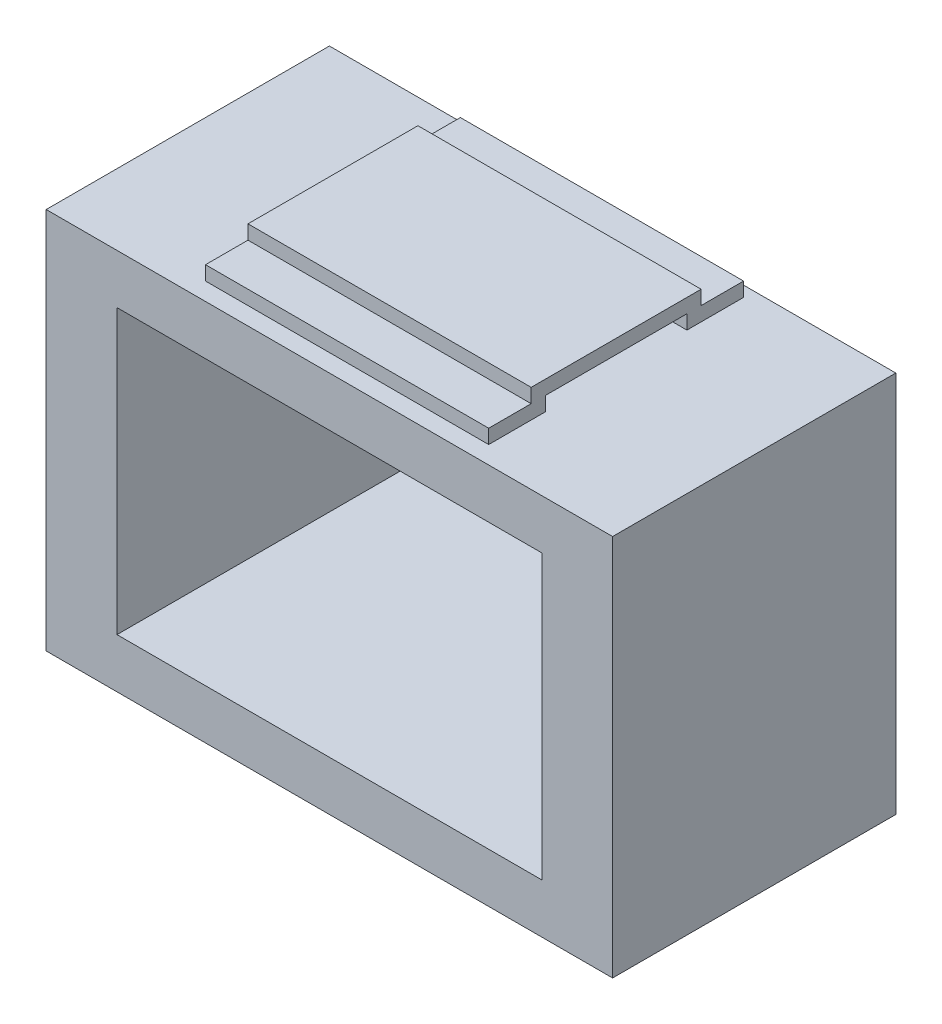
ISO-10303-21;
HEADER;
FILE_DESCRIPTION(('STEP AP214'),'2;1');
FILE_NAME('part.step','',(''),(''),'','','');
FILE_SCHEMA(('AUTOMOTIVE_DESIGN { 1 0 10303 214 1 1 1 1 }'));
ENDSEC;
DATA;
#1=APPLICATION_CONTEXT('core data for automotive mechanical design processes');
#2=APPLICATION_PROTOCOL_DEFINITION('international standard','automotive_design',2000,#1);
#3=PRODUCT_CONTEXT('',#1,'mechanical');
#4=PRODUCT('Part','Part','',(#3));
#5=PRODUCT_RELATED_PRODUCT_CATEGORY('part','',(#4));
#6=PRODUCT_DEFINITION_FORMATION('','',#4);
#7=PRODUCT_DEFINITION_CONTEXT('part definition',#1,'design');
#8=PRODUCT_DEFINITION('design','',#6,#7);
#9=PRODUCT_DEFINITION_SHAPE('','',#8);
#10=(LENGTH_UNIT() NAMED_UNIT(*) SI_UNIT(.MILLI.,.METRE.));
#11=(NAMED_UNIT(*) PLANE_ANGLE_UNIT() SI_UNIT($,.RADIAN.));
#12=(NAMED_UNIT(*) SI_UNIT($,.STERADIAN.) SOLID_ANGLE_UNIT());
#13=UNCERTAINTY_MEASURE_WITH_UNIT(LENGTH_MEASURE(1.E-05),#10,'distance_accuracy_value','');
#14=(GEOMETRIC_REPRESENTATION_CONTEXT(3) GLOBAL_UNCERTAINTY_ASSIGNED_CONTEXT((#13)) GLOBAL_UNIT_ASSIGNED_CONTEXT((#10,
#11,#12)) REPRESENTATION_CONTEXT('',''));
#15=CARTESIAN_POINT('',(0.,0.,0.));
#16=DIRECTION('',(0.,0.,1.));
#17=DIRECTION('',(1.,0.,0.));
#18=AXIS2_PLACEMENT_3D('',#15,#16,#17);
#19=CARTESIAN_POINT('',(50.,5.,-110.));
#20=DIRECTION('',(0.,1.,0.));
#21=DIRECTION('',(0.,0.,1.));
#22=AXIS2_PLACEMENT_3D('',#19,#20,#21);
#23=PLANE('',#22);
#24=DIRECTION('',(-1.,0.,0.));
#25=VECTOR('',#24,1.);
#26=CARTESIAN_POINT('',(20.,5.00000000000003,-48.25));
#27=LINE('',#26,#25);
#28=CARTESIAN_POINT('',(20.,5.,-48.25));
#29=VERTEX_POINT('',#28);
#30=CARTESIAN_POINT('',(-20.,5.00000000000003,-48.25));
#31=VERTEX_POINT('',#30);
#32=EDGE_CURVE('E43',#29,#31,#27,.T.);
#33=ORIENTED_EDGE('',*,*,#32,.T.);
#34=DIRECTION('',(0.,0.,-1.));
#35=VECTOR('',#34,1.);
#36=CARTESIAN_POINT('',(-20.,5.00000000000002,0.));
#37=LINE('',#36,#35);
#38=CARTESIAN_POINT('',(-20.,5.,-68.25));
#39=VERTEX_POINT('',#38);
#40=EDGE_CURVE('E11',#31,#39,#37,.T.);
#41=ORIENTED_EDGE('',*,*,#40,.T.);
#42=DIRECTION('',(-1.,0.,0.));
#43=VECTOR('',#42,1.);
#44=CARTESIAN_POINT('',(20.,5.00000000000003,-68.25));
#45=LINE('',#44,#43);
#46=CARTESIAN_POINT('',(20.,5.,-68.25));
#47=VERTEX_POINT('',#46);
#48=EDGE_CURVE('E61',#47,#39,#45,.T.);
#49=ORIENTED_EDGE('',*,*,#48,.F.);
#50=DIRECTION('',(0.,0.,-1.));
#51=VECTOR('',#50,1.);
#52=CARTESIAN_POINT('',(20.,5.00000000000002,0.));
#53=LINE('',#52,#51);
#54=EDGE_CURVE('E314',#29,#47,#53,.T.);
#55=ORIENTED_EDGE('',*,*,#54,.F.);
#56=EDGE_LOOP('',(#33,#41,#49,#55));
#57=FACE_BOUND('',#56,.T.);
#58=ADVANCED_FACE('F40',(#57),#23,.F.);
#59=CARTESIAN_POINT('',(10.,33.,-52.5));
#60=DIRECTION('',(0.,-1.,0.));
#61=DIRECTION('',(0.,0.,-1.));
#62=AXIS2_PLACEMENT_3D('',#59,#60,#61);
#63=PLANE('',#62);
#64=DIRECTION('',(0.,0.,1.));
#65=VECTOR('',#64,1.);
#66=CARTESIAN_POINT('',(-10.,33.,-52.5));
#67=LINE('',#66,#65);
#68=CARTESIAN_POINT('',(-10.,33.,-52.5));
#69=VERTEX_POINT('',#68);
#70=CARTESIAN_POINT('',(-10.,33.,-49.5));
#71=VERTEX_POINT('',#70);
#72=EDGE_CURVE('E224',#69,#71,#67,.T.);
#73=ORIENTED_EDGE('',*,*,#72,.T.);
#74=DIRECTION('',(-1.,0.,0.));
#75=VECTOR('',#74,1.);
#76=CARTESIAN_POINT('',(10.,33.,-49.5));
#77=LINE('',#76,#75);
#78=CARTESIAN_POINT('',(10.,33.,-49.5));
#79=VERTEX_POINT('',#78);
#80=EDGE_CURVE('E251',#79,#71,#77,.T.);
#81=ORIENTED_EDGE('',*,*,#80,.F.);
#82=DIRECTION('',(0.,0.,1.));
#83=VECTOR('',#82,1.);
#84=CARTESIAN_POINT('',(10.,33.,-52.5));
#85=LINE('',#84,#83);
#86=CARTESIAN_POINT('',(10.,33.,-52.5));
#87=VERTEX_POINT('',#86);
#88=EDGE_CURVE('E249',#87,#79,#85,.T.);
#89=ORIENTED_EDGE('',*,*,#88,.F.);
#90=DIRECTION('',(-1.,0.,0.));
#91=VECTOR('',#90,1.);
#92=CARTESIAN_POINT('',(10.,33.,-52.5));
#93=LINE('',#92,#91);
#94=EDGE_CURVE('E279',#87,#69,#93,.T.);
#95=ORIENTED_EDGE('',*,*,#94,.T.);
#96=EDGE_LOOP('',(#73,#81,#89,#95));
#97=FACE_BOUND('',#96,.T.);
#98=ADVANCED_FACE('F353',(#97),#63,.F.);
#99=CARTESIAN_POINT('',(10.,34.,-52.5));
#100=DIRECTION('',(0.,0.,-1.));
#101=DIRECTION('',(0.,1.,0.));
#102=AXIS2_PLACEMENT_3D('',#99,#100,#101);
#103=PLANE('',#102);
#104=DIRECTION('',(0.,-1.,0.));
#105=VECTOR('',#104,1.);
#106=CARTESIAN_POINT('',(-10.,34.,-52.5));
#107=LINE('',#106,#105);
#108=CARTESIAN_POINT('',(-10.,34.,-52.5));
#109=VERTEX_POINT('',#108);
#110=EDGE_CURVE('E274',#109,#69,#107,.T.);
#111=ORIENTED_EDGE('',*,*,#110,.T.);
#112=ORIENTED_EDGE('',*,*,#94,.F.);
#113=DIRECTION('',(0.,-1.,0.));
#114=VECTOR('',#113,1.);
#115=CARTESIAN_POINT('',(10.,34.,-52.5));
#116=LINE('',#115,#114);
#117=CARTESIAN_POINT('',(10.,34.,-52.5));
#118=VERTEX_POINT('',#117);
#119=EDGE_CURVE('E247',#118,#87,#116,.T.);
#120=ORIENTED_EDGE('',*,*,#119,.F.);
#121=DIRECTION('',(-1.,0.,0.));
#122=VECTOR('',#121,1.);
#123=CARTESIAN_POINT('',(10.,34.,-52.5));
#124=LINE('',#123,#122);
#125=EDGE_CURVE('E282',#118,#109,#124,.T.);
#126=ORIENTED_EDGE('',*,*,#125,.T.);
#127=EDGE_LOOP('',(#111,#112,#120,#126));
#128=FACE_BOUND('',#127,.T.);
#129=ADVANCED_FACE('F357',(#128),#103,.F.);
#130=CARTESIAN_POINT('',(10.,34.,-64.5));
#131=DIRECTION('',(0.,-1.,0.));
#132=DIRECTION('',(0.,0.,-1.));
#133=AXIS2_PLACEMENT_3D('',#130,#131,#132);
#134=PLANE('',#133);
#135=DIRECTION('',(0.,0.,1.));
#136=VECTOR('',#135,1.);
#137=CARTESIAN_POINT('',(-10.,34.,-64.5));
#138=LINE('',#137,#136);
#139=CARTESIAN_POINT('',(-10.,34.,-64.5));
#140=VERTEX_POINT('',#139);
#141=EDGE_CURVE('E272',#140,#109,#138,.T.);
#142=ORIENTED_EDGE('',*,*,#141,.T.);
#143=ORIENTED_EDGE('',*,*,#125,.F.);
#144=DIRECTION('',(0.,0.,1.));
#145=VECTOR('',#144,1.);
#146=CARTESIAN_POINT('',(10.,34.,-64.5));
#147=LINE('',#146,#145);
#148=CARTESIAN_POINT('',(10.,34.,-64.5));
#149=VERTEX_POINT('',#148);
#150=EDGE_CURVE('E245',#149,#118,#147,.T.);
#151=ORIENTED_EDGE('',*,*,#150,.F.);
#152=DIRECTION('',(-1.,0.,0.));
#153=VECTOR('',#152,1.);
#154=CARTESIAN_POINT('',(10.,34.,-64.5));
#155=LINE('',#154,#153);
#156=EDGE_CURVE('E285',#149,#140,#155,.T.);
#157=ORIENTED_EDGE('',*,*,#156,.T.);
#158=EDGE_LOOP('',(#142,#143,#151,#157));
#159=FACE_BOUND('',#158,.T.);
#160=ADVANCED_FACE('F363',(#159),#134,.F.);
#161=CARTESIAN_POINT('',(10.,33.,-64.5));
#162=DIRECTION('',(0.,0.,1.));
#163=DIRECTION('',(1.,0.,0.));
#164=AXIS2_PLACEMENT_3D('',#161,#162,#163);
#165=PLANE('',#164);
#166=DIRECTION('',(0.,1.,0.));
#167=VECTOR('',#166,1.);
#168=CARTESIAN_POINT('',(-10.,33.,-64.5));
#169=LINE('',#168,#167);
#170=CARTESIAN_POINT('',(-10.,33.,-64.5));
#171=VERTEX_POINT('',#170);
#172=EDGE_CURVE('E270',#171,#140,#169,.T.);
#173=ORIENTED_EDGE('',*,*,#172,.T.);
#174=ORIENTED_EDGE('',*,*,#156,.F.);
#175=DIRECTION('',(0.,1.,0.));
#176=VECTOR('',#175,1.);
#177=CARTESIAN_POINT('',(10.,33.,-64.5));
#178=LINE('',#177,#176);
#179=CARTESIAN_POINT('',(10.,33.,-64.5));
#180=VERTEX_POINT('',#179);
#181=EDGE_CURVE('E243',#180,#149,#178,.T.);
#182=ORIENTED_EDGE('',*,*,#181,.F.);
#183=DIRECTION('',(-1.,0.,0.));
#184=VECTOR('',#183,1.);
#185=CARTESIAN_POINT('',(10.,33.,-64.5));
#186=LINE('',#185,#184);
#187=EDGE_CURVE('E288',#180,#171,#186,.T.);
#188=ORIENTED_EDGE('',*,*,#187,.T.);
#189=EDGE_LOOP('',(#173,#174,#182,#188));
#190=FACE_BOUND('',#189,.T.);
#191=ADVANCED_FACE('F372',(#190),#165,.F.);
#192=CARTESIAN_POINT('',(10.,33.,-67.5));
#193=DIRECTION('',(0.,-1.,0.));
#194=DIRECTION('',(0.,0.,-1.));
#195=AXIS2_PLACEMENT_3D('',#192,#193,#194);
#196=PLANE('',#195);
#197=DIRECTION('',(0.,0.,1.));
#198=VECTOR('',#197,1.);
#199=CARTESIAN_POINT('',(-10.,33.,-67.5));
#200=LINE('',#199,#198);
#201=CARTESIAN_POINT('',(-10.,33.,-67.5));
#202=VERTEX_POINT('',#201);
#203=EDGE_CURVE('E268',#202,#171,#200,.T.);
#204=ORIENTED_EDGE('',*,*,#203,.T.);
#205=ORIENTED_EDGE('',*,*,#187,.F.);
#206=DIRECTION('',(0.,0.,1.));
#207=VECTOR('',#206,1.);
#208=CARTESIAN_POINT('',(10.,33.,-67.5));
#209=LINE('',#208,#207);
#210=CARTESIAN_POINT('',(10.,33.,-67.5));
#211=VERTEX_POINT('',#210);
#212=EDGE_CURVE('E241',#211,#180,#209,.T.);
#213=ORIENTED_EDGE('',*,*,#212,.F.);
#214=DIRECTION('',(-1.,0.,0.));
#215=VECTOR('',#214,1.);
#216=CARTESIAN_POINT('',(10.,33.,-67.5));
#217=LINE('',#216,#215);
#218=EDGE_CURVE('E291',#211,#202,#217,.T.);
#219=ORIENTED_EDGE('',*,*,#218,.T.);
#220=EDGE_LOOP('',(#204,#205,#213,#219));
#221=FACE_BOUND('',#220,.T.);
#222=ADVANCED_FACE('F376',(#221),#196,.F.);
#223=CARTESIAN_POINT('',(10.,33.,-64.5));
#224=DIRECTION('',(0.,-1.,0.));
#225=DIRECTION('',(0.,0.,-1.));
#226=AXIS2_PLACEMENT_3D('',#223,#224,#225);
#227=PLANE('',#226);
#228=DIRECTION('',(0.,0.,-1.));
#229=VECTOR('',#228,1.);
#230=CARTESIAN_POINT('',(-10.,33.,-64.5));
#231=LINE('',#230,#229);
#232=CARTESIAN_POINT('',(-10.,33.,-63.5));
#233=VERTEX_POINT('',#232);
#234=CARTESIAN_POINT('',(-10.,33.,-53.5));
#235=VERTEX_POINT('',#234);
#236=EDGE_CURVE('E258',#233,#235,#231,.F.);
#237=ORIENTED_EDGE('',*,*,#236,.F.);
#238=DIRECTION('',(-1.,0.,0.));
#239=VECTOR('',#238,1.);
#240=CARTESIAN_POINT('',(10.,33.,-63.5));
#241=LINE('',#240,#239);
#242=CARTESIAN_POINT('',(10.,33.,-63.5));
#243=VERTEX_POINT('',#242);
#244=EDGE_CURVE('E300',#243,#233,#241,.T.);
#245=ORIENTED_EDGE('',*,*,#244,.F.);
#246=DIRECTION('',(0.,0.,-1.));
#247=VECTOR('',#246,1.);
#248=CARTESIAN_POINT('',(10.,33.,-64.5));
#249=LINE('',#248,#247);
#250=CARTESIAN_POINT('',(10.,33.,-53.5));
#251=VERTEX_POINT('',#250);
#252=EDGE_CURVE('E230',#243,#251,#249,.F.);
#253=ORIENTED_EDGE('',*,*,#252,.T.);
#254=DIRECTION('',(-1.,0.,0.));
#255=VECTOR('',#254,1.);
#256=CARTESIAN_POINT('',(10.,33.,-53.5));
#257=LINE('',#256,#255);
#258=EDGE_CURVE('E302',#251,#235,#257,.T.);
#259=ORIENTED_EDGE('',*,*,#258,.T.);
#260=EDGE_LOOP('',(#237,#245,#253,#259));
#261=FACE_BOUND('',#260,.T.);
#262=ADVANCED_FACE('F380',(#261),#227,.T.);
#263=CARTESIAN_POINT('',(10.,34.,-53.5));
#264=DIRECTION('',(0.,0.,-1.));
#265=DIRECTION('',(0.,1.,0.));
#266=AXIS2_PLACEMENT_3D('',#263,#264,#265);
#267=PLANE('',#266);
#268=DIRECTION('',(0.,-1.,0.));
#269=VECTOR('',#268,1.);
#270=CARTESIAN_POINT('',(-10.,34.,-53.5));
#271=LINE('',#270,#269);
#272=CARTESIAN_POINT('',(-10.,32.,-53.5));
#273=VERTEX_POINT('',#272);
#274=EDGE_CURVE('E256',#235,#273,#271,.T.);
#275=ORIENTED_EDGE('',*,*,#274,.F.);
#276=ORIENTED_EDGE('',*,*,#258,.F.);
#277=DIRECTION('',(0.,-1.,0.));
#278=VECTOR('',#277,1.);
#279=CARTESIAN_POINT('',(10.,34.,-53.5));
#280=LINE('',#279,#278);
#281=CARTESIAN_POINT('',(10.,32.,-53.5));
#282=VERTEX_POINT('',#281);
#283=EDGE_CURVE('E227',#251,#282,#280,.T.);
#284=ORIENTED_EDGE('',*,*,#283,.T.);
#285=DIRECTION('',(-1.,0.,0.));
#286=VECTOR('',#285,1.);
#287=CARTESIAN_POINT('',(10.,32.,-53.5));
#288=LINE('',#287,#286);
#289=EDGE_CURVE('E304',#282,#273,#288,.T.);
#290=ORIENTED_EDGE('',*,*,#289,.T.);
#291=EDGE_LOOP('',(#275,#276,#284,#290));
#292=FACE_BOUND('',#291,.T.);
#293=ADVANCED_FACE('F394',(#292),#267,.T.);
#294=CARTESIAN_POINT('',(10.,33.,-49.5));
#295=DIRECTION('',(0.,0.,-1.));
#296=DIRECTION('',(-1.,0.,0.));
#297=AXIS2_PLACEMENT_3D('',#294,#295,#296);
#298=PLANE('',#297);
#299=DIRECTION('',(0.,-1.,0.));
#300=VECTOR('',#299,1.);
#301=CARTESIAN_POINT('',(-10.,33.,-49.5));
#302=LINE('',#301,#300);
#303=CARTESIAN_POINT('',(-10.,32.,-49.5));
#304=VERTEX_POINT('',#303);
#305=EDGE_CURVE('E197',#71,#304,#302,.T.);
#306=ORIENTED_EDGE('',*,*,#305,.T.);
#307=DIRECTION('',(-1.,0.,0.));
#308=VECTOR('',#307,1.);
#309=CARTESIAN_POINT('',(10.,32.,-49.5));
#310=LINE('',#309,#308);
#311=CARTESIAN_POINT('',(10.,32.,-49.5));
#312=VERTEX_POINT('',#311);
#313=EDGE_CURVE('E307',#312,#304,#310,.T.);
#314=ORIENTED_EDGE('',*,*,#313,.F.);
#315=DIRECTION('',(0.,-1.,0.));
#316=VECTOR('',#315,1.);
#317=CARTESIAN_POINT('',(10.,33.,-49.5));
#318=LINE('',#317,#316);
#319=EDGE_CURVE('E221',#79,#312,#318,.T.);
#320=ORIENTED_EDGE('',*,*,#319,.F.);
#321=ORIENTED_EDGE('',*,*,#80,.T.);
#322=EDGE_LOOP('',(#306,#314,#320,#321));
#323=FACE_BOUND('',#322,.T.);
#324=ADVANCED_FACE('F385',(#323),#298,.F.);
#325=CARTESIAN_POINT('',(10.,32.,-67.5));
#326=DIRECTION('',(0.,0.,1.));
#327=DIRECTION('',(1.,0.,0.));
#328=AXIS2_PLACEMENT_3D('',#325,#326,#327);
#329=PLANE('',#328);
#330=DIRECTION('',(0.,1.,0.));
#331=VECTOR('',#330,1.);
#332=CARTESIAN_POINT('',(-10.,32.,-67.5));
#333=LINE('',#332,#331);
#334=CARTESIAN_POINT('',(-10.,32.,-67.5));
#335=VERTEX_POINT('',#334);
#336=EDGE_CURVE('E266',#335,#202,#333,.T.);
#337=ORIENTED_EDGE('',*,*,#336,.T.);
#338=ORIENTED_EDGE('',*,*,#218,.F.);
#339=DIRECTION('',(0.,1.,0.));
#340=VECTOR('',#339,1.);
#341=CARTESIAN_POINT('',(10.,32.,-67.5));
#342=LINE('',#341,#340);
#343=CARTESIAN_POINT('',(10.,32.,-67.5));
#344=VERTEX_POINT('',#343);
#345=EDGE_CURVE('E239',#344,#211,#342,.T.);
#346=ORIENTED_EDGE('',*,*,#345,.F.);
#347=DIRECTION('',(-1.,0.,0.));
#348=VECTOR('',#347,1.);
#349=CARTESIAN_POINT('',(10.,32.,-67.5));
#350=LINE('',#349,#348);
#351=EDGE_CURVE('E294',#344,#335,#350,.T.);
#352=ORIENTED_EDGE('',*,*,#351,.T.);
#353=EDGE_LOOP('',(#337,#338,#346,#352));
#354=FACE_BOUND('',#353,.T.);
#355=ADVANCED_FACE('F382',(#354),#329,.F.);
#356=CARTESIAN_POINT('',(-10.,0.,0.));
#357=DIRECTION('',(-1.,0.,0.));
#358=DIRECTION('',(0.,0.,1.));
#359=AXIS2_PLACEMENT_3D('',#356,#357,#358);
#360=PLANE('',#359);
#361=ORIENTED_EDGE('',*,*,#305,.F.);
#362=ORIENTED_EDGE('',*,*,#72,.F.);
#363=ORIENTED_EDGE('',*,*,#110,.F.);
#364=ORIENTED_EDGE('',*,*,#141,.F.);
#365=ORIENTED_EDGE('',*,*,#172,.F.);
#366=ORIENTED_EDGE('',*,*,#203,.F.);
#367=ORIENTED_EDGE('',*,*,#336,.F.);
#368=DIRECTION('',(0.,0.,1.));
#369=VECTOR('',#368,1.);
#370=CARTESIAN_POINT('',(-10.,32.,-67.5));
#371=LINE('',#370,#369);
#372=CARTESIAN_POINT('',(-10.,32.,-63.5));
#373=VERTEX_POINT('',#372);
#374=EDGE_CURVE('E264',#335,#373,#371,.T.);
#375=ORIENTED_EDGE('',*,*,#374,.T.);
#376=DIRECTION('',(0.,1.,0.));
#377=VECTOR('',#376,1.);
#378=CARTESIAN_POINT('',(-10.,33.,-63.5));
#379=LINE('',#378,#377);
#380=EDGE_CURVE('E261',#373,#233,#379,.T.);
#381=ORIENTED_EDGE('',*,*,#380,.T.);
#382=ORIENTED_EDGE('',*,*,#236,.T.);
#383=ORIENTED_EDGE('',*,*,#274,.T.);
#384=DIRECTION('',(0.,0.,1.));
#385=VECTOR('',#384,1.);
#386=CARTESIAN_POINT('',(-10.,32.,-52.5));
#387=LINE('',#386,#385);
#388=EDGE_CURVE('E254',#273,#304,#387,.T.);
#389=ORIENTED_EDGE('',*,*,#388,.T.);
#390=EDGE_LOOP('',(#361,#362,#363,#364,#365,#366,#367,#375,#381,#382,#383,#389));
#391=FACE_BOUND('',#390,.T.);
#392=ADVANCED_FACE('F367',(#391),#360,.T.);
#393=CARTESIAN_POINT('',(10.,33.,-63.5));
#394=DIRECTION('',(0.,0.,1.));
#395=DIRECTION('',(1.,0.,0.));
#396=AXIS2_PLACEMENT_3D('',#393,#394,#395);
#397=PLANE('',#396);
#398=ORIENTED_EDGE('',*,*,#380,.F.);
#399=DIRECTION('',(-1.,0.,0.));
#400=VECTOR('',#399,1.);
#401=CARTESIAN_POINT('',(10.,32.,-63.5));
#402=LINE('',#401,#400);
#403=CARTESIAN_POINT('',(10.,32.,-63.5));
#404=VERTEX_POINT('',#403);
#405=EDGE_CURVE('E297',#404,#373,#402,.T.);
#406=ORIENTED_EDGE('',*,*,#405,.F.);
#407=DIRECTION('',(0.,1.,0.));
#408=VECTOR('',#407,1.);
#409=CARTESIAN_POINT('',(10.,33.,-63.5));
#410=LINE('',#409,#408);
#411=EDGE_CURVE('E233',#404,#243,#410,.T.);
#412=ORIENTED_EDGE('',*,*,#411,.T.);
#413=ORIENTED_EDGE('',*,*,#244,.T.);
#414=EDGE_LOOP('',(#398,#406,#412,#413));
#415=FACE_BOUND('',#414,.T.);
#416=ADVANCED_FACE('F387',(#415),#397,.T.);
#417=CARTESIAN_POINT('',(10.,0.,0.));
#418=DIRECTION('',(-1.,0.,0.));
#419=DIRECTION('',(0.,0.,1.));
#420=AXIS2_PLACEMENT_3D('',#417,#418,#419);
#421=PLANE('',#420);
#422=ORIENTED_EDGE('',*,*,#319,.T.);
#423=DIRECTION('',(0.,0.,1.));
#424=VECTOR('',#423,1.);
#425=CARTESIAN_POINT('',(10.,32.,-50.5));
#426=LINE('',#425,#424);
#427=EDGE_CURVE('E223',#282,#312,#426,.T.);
#428=ORIENTED_EDGE('',*,*,#427,.F.);
#429=ORIENTED_EDGE('',*,*,#283,.F.);
#430=ORIENTED_EDGE('',*,*,#252,.F.);
#431=ORIENTED_EDGE('',*,*,#411,.F.);
#432=DIRECTION('',(0.,0.,-1.));
#433=VECTOR('',#432,1.);
#434=CARTESIAN_POINT('',(10.,32.,-67.5));
#435=LINE('',#434,#433);
#436=EDGE_CURVE('E236',#344,#404,#435,.F.);
#437=ORIENTED_EDGE('',*,*,#436,.F.);
#438=ORIENTED_EDGE('',*,*,#345,.T.);
#439=ORIENTED_EDGE('',*,*,#212,.T.);
#440=ORIENTED_EDGE('',*,*,#181,.T.);
#441=ORIENTED_EDGE('',*,*,#150,.T.);
#442=ORIENTED_EDGE('',*,*,#119,.T.);
#443=ORIENTED_EDGE('',*,*,#88,.T.);
#444=EDGE_LOOP('',(#422,#428,#429,#430,#431,#437,#438,#439,#440,#441,#442,#443));
#445=FACE_BOUND('',#444,.T.);
#446=ADVANCED_FACE('F390',(#445),#421,.F.);
#447=CARTESIAN_POINT('',(15.,8.50000000000003,110.001));
#448=DIRECTION('',(1.,0.,0.));
#449=DIRECTION('',(0.,0.,-1.));
#450=AXIS2_PLACEMENT_3D('',#447,#448,#449);
#451=PLANE('',#450);
#452=DIRECTION('',(0.,1.,0.));
#453=VECTOR('',#452,1.);
#454=CARTESIAN_POINT('',(15.,8.50000000000011,-48.25));
#455=LINE('',#454,#453);
#456=CARTESIAN_POINT('',(15.,8.50000000000003,-48.25));
#457=VERTEX_POINT('',#456);
#458=CARTESIAN_POINT('',(15.,28.5,-48.25));
#459=VERTEX_POINT('',#458);
#460=EDGE_CURVE('E207',#457,#459,#455,.T.);
#461=ORIENTED_EDGE('',*,*,#460,.T.);
#462=DIRECTION('',(0.,0.,-1.));
#463=VECTOR('',#462,1.);
#464=CARTESIAN_POINT('',(15.,28.5,110.001));
#465=LINE('',#464,#463);
#466=CARTESIAN_POINT('',(15.,28.5,-68.25));
#467=VERTEX_POINT('',#466);
#468=EDGE_CURVE('E188',#459,#467,#465,.T.);
#469=ORIENTED_EDGE('',*,*,#468,.T.);
#470=DIRECTION('',(0.,-1.,0.));
#471=VECTOR('',#470,1.);
#472=CARTESIAN_POINT('',(15.,8.50000000000003,-68.25));
#473=LINE('',#472,#471);
#474=CARTESIAN_POINT('',(15.,8.50000000000003,-68.25));
#475=VERTEX_POINT('',#474);
#476=EDGE_CURVE('E212',#467,#475,#473,.T.);
#477=ORIENTED_EDGE('',*,*,#476,.T.);
#478=DIRECTION('',(0.,0.,-1.));
#479=VECTOR('',#478,1.);
#480=CARTESIAN_POINT('',(15.,8.50000000000003,110.001));
#481=LINE('',#480,#479);
#482=EDGE_CURVE('E218',#457,#475,#481,.T.);
#483=ORIENTED_EDGE('',*,*,#482,.F.);
#484=EDGE_LOOP('',(#461,#469,#477,#483));
#485=FACE_BOUND('',#484,.T.);
#486=ADVANCED_FACE('F452',(#485),#451,.F.);
#487=CARTESIAN_POINT('',(15.,8.50000000000003,110.001));
#488=DIRECTION('',(0.,-1.,0.));
#489=DIRECTION('',(0.,0.,-1.));
#490=AXIS2_PLACEMENT_3D('',#487,#488,#489);
#491=PLANE('',#490);
#492=DIRECTION('',(1.,0.,0.));
#493=VECTOR('',#492,1.);
#494=CARTESIAN_POINT('',(15.,8.50000000000003,-48.25));
#495=LINE('',#494,#493);
#496=CARTESIAN_POINT('',(-15.,8.50000000000003,-48.25));
#497=VERTEX_POINT('',#496);
#498=EDGE_CURVE('E203',#497,#457,#495,.T.);
#499=ORIENTED_EDGE('',*,*,#498,.T.);
#500=ORIENTED_EDGE('',*,*,#482,.T.);
#501=DIRECTION('',(-1.,0.,0.));
#502=VECTOR('',#501,1.);
#503=CARTESIAN_POINT('',(15.,8.50000000000003,-68.25));
#504=LINE('',#503,#502);
#505=CARTESIAN_POINT('',(-15.,8.50000000000003,-68.25));
#506=VERTEX_POINT('',#505);
#507=EDGE_CURVE('E189',#475,#506,#504,.T.);
#508=ORIENTED_EDGE('',*,*,#507,.T.);
#509=DIRECTION('',(0.,0.,-1.));
#510=VECTOR('',#509,1.);
#511=CARTESIAN_POINT('',(-15.,8.50000000000003,110.001));
#512=LINE('',#511,#510);
#513=EDGE_CURVE('E198',#497,#506,#512,.T.);
#514=ORIENTED_EDGE('',*,*,#513,.F.);
#515=EDGE_LOOP('',(#499,#500,#508,#514));
#516=FACE_BOUND('',#515,.T.);
#517=ADVANCED_FACE('F459',(#516),#491,.F.);
#518=CARTESIAN_POINT('',(-15.,8.50000000000003,110.001));
#519=DIRECTION('',(-1.,0.,0.));
#520=DIRECTION('',(0.,0.,1.));
#521=AXIS2_PLACEMENT_3D('',#518,#519,#520);
#522=PLANE('',#521);
#523=DIRECTION('',(0.,-1.,0.));
#524=VECTOR('',#523,1.);
#525=CARTESIAN_POINT('',(-15.,8.50000000000011,-48.25));
#526=LINE('',#525,#524);
#527=CARTESIAN_POINT('',(-15.,28.5,-48.25));
#528=VERTEX_POINT('',#527);
#529=EDGE_CURVE('E181',#528,#497,#526,.T.);
#530=ORIENTED_EDGE('',*,*,#529,.T.);
#531=ORIENTED_EDGE('',*,*,#513,.T.);
#532=DIRECTION('',(0.,1.,0.));
#533=VECTOR('',#532,1.);
#534=CARTESIAN_POINT('',(-15.,8.50000000000003,-68.25));
#535=LINE('',#534,#533);
#536=CARTESIAN_POINT('',(-15.,28.5,-68.25));
#537=VERTEX_POINT('',#536);
#538=EDGE_CURVE('E184',#506,#537,#535,.T.);
#539=ORIENTED_EDGE('',*,*,#538,.T.);
#540=DIRECTION('',(0.,0.,-1.));
#541=VECTOR('',#540,1.);
#542=CARTESIAN_POINT('',(-15.,28.5,110.001));
#543=LINE('',#542,#541);
#544=EDGE_CURVE('E177',#528,#537,#543,.T.);
#545=ORIENTED_EDGE('',*,*,#544,.F.);
#546=EDGE_LOOP('',(#530,#531,#539,#545));
#547=FACE_BOUND('',#546,.T.);
#548=ADVANCED_FACE('F179',(#547),#522,.F.);
#549=CARTESIAN_POINT('',(15.,28.5,110.001));
#550=DIRECTION('',(0.,1.,0.));
#551=DIRECTION('',(0.,0.,1.));
#552=AXIS2_PLACEMENT_3D('',#549,#550,#551);
#553=PLANE('',#552);
#554=DIRECTION('',(-1.,0.,0.));
#555=VECTOR('',#554,1.);
#556=CARTESIAN_POINT('',(15.,28.5,-48.25));
#557=LINE('',#556,#555);
#558=EDGE_CURVE('E193',#459,#528,#557,.T.);
#559=ORIENTED_EDGE('',*,*,#558,.T.);
#560=ORIENTED_EDGE('',*,*,#544,.T.);
#561=DIRECTION('',(1.,0.,0.));
#562=VECTOR('',#561,1.);
#563=CARTESIAN_POINT('',(15.,28.5,-68.25));
#564=LINE('',#563,#562);
#565=EDGE_CURVE('E205',#537,#467,#564,.T.);
#566=ORIENTED_EDGE('',*,*,#565,.T.);
#567=ORIENTED_EDGE('',*,*,#468,.F.);
#568=EDGE_LOOP('',(#559,#560,#566,#567));
#569=FACE_BOUND('',#568,.T.);
#570=ADVANCED_FACE('F194',(#569),#553,.F.);
#571=CARTESIAN_POINT('',(20.,0.,-68.25));
#572=DIRECTION('',(0.,0.,1.));
#573=DIRECTION('',(1.,0.,0.));
#574=AXIS2_PLACEMENT_3D('',#571,#572,#573);
#575=PLANE('',#574);
#576=ORIENTED_EDGE('',*,*,#565,.F.);
#577=ORIENTED_EDGE('',*,*,#538,.F.);
#578=ORIENTED_EDGE('',*,*,#507,.F.);
#579=ORIENTED_EDGE('',*,*,#476,.F.);
#580=EDGE_LOOP('',(#576,#577,#578,#579));
#581=FACE_BOUND('',#580,.T.);
#582=DIRECTION('',(0.,1.,0.));
#583=VECTOR('',#582,1.);
#584=CARTESIAN_POINT('',(-20.,0.,-68.25));
#585=LINE('',#584,#583);
#586=CARTESIAN_POINT('',(-20.,32.,-68.25));
#587=VERTEX_POINT('',#586);
#588=EDGE_CURVE('E323',#39,#587,#585,.T.);
#589=ORIENTED_EDGE('',*,*,#588,.T.);
#590=DIRECTION('',(-1.,0.,0.));
#591=VECTOR('',#590,1.);
#592=CARTESIAN_POINT('',(20.,32.,-68.25));
#593=LINE('',#592,#591);
#594=CARTESIAN_POINT('',(20.,32.,-68.25));
#595=VERTEX_POINT('',#594);
#596=EDGE_CURVE('E329',#595,#587,#593,.T.);
#597=ORIENTED_EDGE('',*,*,#596,.F.);
#598=DIRECTION('',(0.,1.,0.));
#599=VECTOR('',#598,1.);
#600=CARTESIAN_POINT('',(20.,0.,-68.25));
#601=LINE('',#600,#599);
#602=EDGE_CURVE('E317',#47,#595,#601,.T.);
#603=ORIENTED_EDGE('',*,*,#602,.F.);
#604=ORIENTED_EDGE('',*,*,#48,.T.);
#605=EDGE_LOOP('',(#589,#597,#603,#604));
#606=FACE_BOUND('',#605,.T.);
#607=ADVANCED_FACE('F342',(#581,#606),#575,.F.);
#608=CARTESIAN_POINT('',(20.,32.,0.));
#609=DIRECTION('',(0.,-1.,0.));
#610=DIRECTION('',(0.,0.,-1.));
#611=AXIS2_PLACEMENT_3D('',#608,#609,#610);
#612=PLANE('',#611);
#613=ORIENTED_EDGE('',*,*,#436,.T.);
#614=ORIENTED_EDGE('',*,*,#405,.T.);
#615=ORIENTED_EDGE('',*,*,#374,.F.);
#616=ORIENTED_EDGE('',*,*,#351,.F.);
#617=EDGE_LOOP('',(#613,#614,#615,#616));
#618=FACE_BOUND('',#617,.T.);
#619=DIRECTION('',(0.,0.,1.));
#620=VECTOR('',#619,1.);
#621=CARTESIAN_POINT('',(-20.,32.,0.));
#622=LINE('',#621,#620);
#623=CARTESIAN_POINT('',(-20.,32.,-48.25));
#624=VERTEX_POINT('',#623);
#625=EDGE_CURVE('E315',#587,#624,#622,.T.);
#626=ORIENTED_EDGE('',*,*,#625,.T.);
#627=DIRECTION('',(-1.,0.,0.));
#628=VECTOR('',#627,1.);
#629=CARTESIAN_POINT('',(20.,32.,-48.25));
#630=LINE('',#629,#628);
#631=CARTESIAN_POINT('',(20.,32.,-48.25));
#632=VERTEX_POINT('',#631);
#633=EDGE_CURVE('E321',#632,#624,#630,.T.);
#634=ORIENTED_EDGE('',*,*,#633,.F.);
#635=DIRECTION('',(0.,0.,1.));
#636=VECTOR('',#635,1.);
#637=CARTESIAN_POINT('',(20.,32.,0.));
#638=LINE('',#637,#636);
#639=EDGE_CURVE('E319',#595,#632,#638,.T.);
#640=ORIENTED_EDGE('',*,*,#639,.F.);
#641=ORIENTED_EDGE('',*,*,#596,.T.);
#642=EDGE_LOOP('',(#626,#634,#640,#641));
#643=FACE_BOUND('',#642,.T.);
#644=ORIENTED_EDGE('',*,*,#427,.T.);
#645=ORIENTED_EDGE('',*,*,#313,.T.);
#646=ORIENTED_EDGE('',*,*,#388,.F.);
#647=ORIENTED_EDGE('',*,*,#289,.F.);
#648=EDGE_LOOP('',(#644,#645,#646,#647));
#649=FACE_BOUND('',#648,.T.);
#650=ADVANCED_FACE('F338',(#618,#643,#649),#612,.F.);
#651=CARTESIAN_POINT('',(20.,0.,-48.25));
#652=DIRECTION('',(0.,0.,-1.));
#653=DIRECTION('',(0.,1.,0.));
#654=AXIS2_PLACEMENT_3D('',#651,#652,#653);
#655=PLANE('',#654);
#656=ORIENTED_EDGE('',*,*,#498,.F.);
#657=ORIENTED_EDGE('',*,*,#529,.F.);
#658=ORIENTED_EDGE('',*,*,#558,.F.);
#659=ORIENTED_EDGE('',*,*,#460,.F.);
#660=EDGE_LOOP('',(#656,#657,#658,#659));
#661=FACE_BOUND('',#660,.T.);
#662=DIRECTION('',(0.,-1.,0.));
#663=VECTOR('',#662,1.);
#664=CARTESIAN_POINT('',(-20.,0.,-48.25));
#665=LINE('',#664,#663);
#666=EDGE_CURVE('E310',#624,#31,#665,.T.);
#667=ORIENTED_EDGE('',*,*,#666,.T.);
#668=ORIENTED_EDGE('',*,*,#32,.F.);
#669=DIRECTION('',(0.,-1.,0.));
#670=VECTOR('',#669,1.);
#671=CARTESIAN_POINT('',(20.,0.,-48.25));
#672=LINE('',#671,#670);
#673=EDGE_CURVE('E311',#632,#29,#672,.T.);
#674=ORIENTED_EDGE('',*,*,#673,.F.);
#675=ORIENTED_EDGE('',*,*,#633,.T.);
#676=EDGE_LOOP('',(#667,#668,#674,#675));
#677=FACE_BOUND('',#676,.T.);
#678=ADVANCED_FACE('F200',(#661,#677),#655,.F.);
#679=CARTESIAN_POINT('',(-20.,0.,0.));
#680=DIRECTION('',(1.,0.,0.));
#681=DIRECTION('',(0.,0.,-1.));
#682=AXIS2_PLACEMENT_3D('',#679,#680,#681);
#683=PLANE('',#682);
#684=ORIENTED_EDGE('',*,*,#666,.F.);
#685=ORIENTED_EDGE('',*,*,#625,.F.);
#686=ORIENTED_EDGE('',*,*,#588,.F.);
#687=ORIENTED_EDGE('',*,*,#40,.F.);
#688=EDGE_LOOP('',(#684,#685,#686,#687));
#689=FACE_BOUND('',#688,.T.);
#690=ADVANCED_FACE('F336',(#689),#683,.F.);
#691=CARTESIAN_POINT('',(20.,0.,0.));
#692=DIRECTION('',(1.,0.,0.));
#693=DIRECTION('',(0.,0.,-1.));
#694=AXIS2_PLACEMENT_3D('',#691,#692,#693);
#695=PLANE('',#694);
#696=ORIENTED_EDGE('',*,*,#673,.T.);
#697=ORIENTED_EDGE('',*,*,#54,.T.);
#698=ORIENTED_EDGE('',*,*,#602,.T.);
#699=ORIENTED_EDGE('',*,*,#639,.T.);
#700=EDGE_LOOP('',(#696,#697,#698,#699));
#701=FACE_BOUND('',#700,.T.);
#702=ADVANCED_FACE('F344',(#701),#695,.T.);
#703=CLOSED_SHELL('',(#58,#98,#129,#160,#191,#222,#262,#293,#324,#355,#392,#416,#446,#486,#517,
#548,#570,#607,#650,#678,#690,#702));
#704=MANIFOLD_SOLID_BREP('B2',#703);
#705=ADVANCED_BREP_SHAPE_REPRESENTATION('',(#18,#704),#14);
#706=SHAPE_DEFINITION_REPRESENTATION(#9,#705);
ENDSEC;
END-ISO-10303-21;
